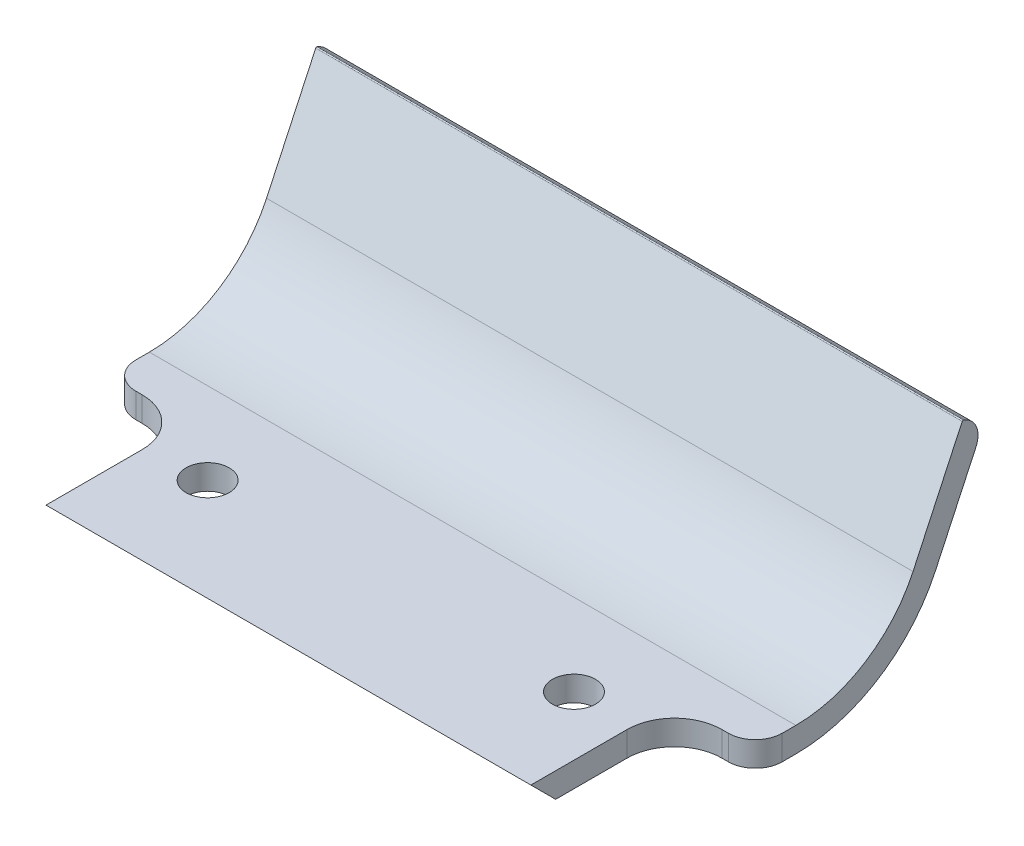
ISO-10303-21;
HEADER;
FILE_DESCRIPTION(('STEP AP214'),'2;1');
FILE_NAME('part.step','',(''),(''),'','','');
FILE_SCHEMA(('AUTOMOTIVE_DESIGN { 1 0 10303 214 1 1 1 1 }'));
ENDSEC;
DATA;
#1=APPLICATION_CONTEXT('core data for automotive mechanical design processes');
#2=APPLICATION_PROTOCOL_DEFINITION('international standard','automotive_design',2000,#1);
#3=PRODUCT_CONTEXT('',#1,'mechanical');
#4=PRODUCT('Part','Part','',(#3));
#5=PRODUCT_RELATED_PRODUCT_CATEGORY('part','',(#4));
#6=PRODUCT_DEFINITION_FORMATION('','',#4);
#7=PRODUCT_DEFINITION_CONTEXT('part definition',#1,'design');
#8=PRODUCT_DEFINITION('design','',#6,#7);
#9=PRODUCT_DEFINITION_SHAPE('','',#8);
#10=(LENGTH_UNIT() NAMED_UNIT(*) SI_UNIT(.MILLI.,.METRE.));
#11=(NAMED_UNIT(*) PLANE_ANGLE_UNIT() SI_UNIT($,.RADIAN.));
#12=(NAMED_UNIT(*) SI_UNIT($,.STERADIAN.) SOLID_ANGLE_UNIT());
#13=UNCERTAINTY_MEASURE_WITH_UNIT(LENGTH_MEASURE(1.E-05),#10,'distance_accuracy_value','');
#14=(GEOMETRIC_REPRESENTATION_CONTEXT(3) GLOBAL_UNCERTAINTY_ASSIGNED_CONTEXT((#13)) GLOBAL_UNIT_ASSIGNED_CONTEXT((#10,
#11,#12)) REPRESENTATION_CONTEXT('',''));
#15=CARTESIAN_POINT('',(0.,0.,0.));
#16=DIRECTION('',(0.,0.,1.));
#17=DIRECTION('',(1.,0.,0.));
#18=AXIS2_PLACEMENT_3D('',#15,#16,#17);
#19=CARTESIAN_POINT('',(30.,0.,0.));
#20=DIRECTION('',(0.,0.707106781186556,-0.707106781186539));
#21=DIRECTION('',(0.,0.707106781186539,0.707106781186556));
#22=AXIS2_PLACEMENT_3D('',#19,#20,#21);
#23=PLANE('',#22);
#24=DIRECTION('',(0.,0.707106781186539,0.707106781186556));
#25=VECTOR('',#24,1.);
#26=CARTESIAN_POINT('',(-22.5,0.,0.));
#27=LINE('',#26,#25);
#28=CARTESIAN_POINT('',(-22.5,-2.3,-2.30000000000006));
#29=VERTEX_POINT('',#28);
#30=CARTESIAN_POINT('',(-22.5,0.,0.));
#31=VERTEX_POINT('',#30);
#32=EDGE_CURVE('E249',#29,#31,#27,.T.);
#33=ORIENTED_EDGE('',*,*,#32,.F.);
#34=DIRECTION('',(-1.,0.,0.));
#35=VECTOR('',#34,1.);
#36=CARTESIAN_POINT('',(30.,-2.3,-2.30000000000006));
#37=LINE('',#36,#35);
#38=CARTESIAN_POINT('',(22.5,-2.3,-2.30000000000006));
#39=VERTEX_POINT('',#38);
#40=EDGE_CURVE('E344',#39,#29,#37,.T.);
#41=ORIENTED_EDGE('',*,*,#40,.F.);
#42=DIRECTION('',(0.,0.707106781186539,0.707106781186556));
#43=VECTOR('',#42,1.);
#44=CARTESIAN_POINT('',(22.5,0.,0.));
#45=LINE('',#44,#43);
#46=CARTESIAN_POINT('',(22.5,0.,0.));
#47=VERTEX_POINT('',#46);
#48=EDGE_CURVE('E201',#39,#47,#45,.T.);
#49=ORIENTED_EDGE('',*,*,#48,.T.);
#50=DIRECTION('',(-1.,0.,0.));
#51=VECTOR('',#50,1.);
#52=CARTESIAN_POINT('',(30.,0.,0.));
#53=LINE('',#52,#51);
#54=EDGE_CURVE('E282',#47,#31,#53,.T.);
#55=ORIENTED_EDGE('',*,*,#54,.T.);
#56=EDGE_LOOP('',(#33,#41,#49,#55));
#57=FACE_BOUND('',#56,.T.);
#58=ADVANCED_FACE('F39',(#57),#23,.F.);
#59=CARTESIAN_POINT('',(30.,-2.3,-2.30000000000006));
#60=DIRECTION('',(0.,1.,0.));
#61=DIRECTION('',(0.,0.,1.));
#62=AXIS2_PLACEMENT_3D('',#59,#60,#61);
#63=PLANE('',#62);
#64=CARTESIAN_POINT('',(17.,-2.3,-9.5));
#65=DIRECTION('',(0.,1.,0.));
#66=DIRECTION('',(0.,0.,1.));
#67=AXIS2_PLACEMENT_3D('',#64,#65,#66);
#68=CIRCLE('',#67,2.);
#69=CARTESIAN_POINT('',(17.,-2.3,-7.5));
#70=VERTEX_POINT('',#69);
#71=EDGE_CURVE('E210',#70,#70,#68,.F.);
#72=ORIENTED_EDGE('',*,*,#71,.F.);
#73=EDGE_LOOP('',(#72));
#74=FACE_BOUND('',#73,.T.);
#75=CARTESIAN_POINT('',(-17.,-2.3,-9.5));
#76=DIRECTION('',(0.,1.,0.));
#77=DIRECTION('',(0.,0.,1.));
#78=AXIS2_PLACEMENT_3D('',#75,#76,#77);
#79=CIRCLE('',#78,2.);
#80=CARTESIAN_POINT('',(-17.,-2.3,-7.5));
#81=VERTEX_POINT('',#80);
#82=EDGE_CURVE('E197',#81,#81,#79,.T.);
#83=ORIENTED_EDGE('',*,*,#82,.T.);
#84=EDGE_LOOP('',(#83));
#85=FACE_BOUND('',#84,.T.);
#86=DIRECTION('',(0.,0.,-1.));
#87=VECTOR('',#86,1.);
#88=CARTESIAN_POINT('',(30.,-2.3,-2.30000000000006));
#89=LINE('',#88,#87);
#90=CARTESIAN_POINT('',(30.,-2.3,-15.83));
#91=VERTEX_POINT('',#90);
#92=CARTESIAN_POINT('',(30.,-2.3,-17.09318355687));
#93=VERTEX_POINT('',#92);
#94=EDGE_CURVE('E253',#91,#93,#89,.T.);
#95=ORIENTED_EDGE('',*,*,#94,.F.);
#96=CARTESIAN_POINT('',(27.5,-2.3,-15.83));
#97=DIRECTION('',(0.,1.,0.));
#98=DIRECTION('',(0.,0.,1.));
#99=AXIS2_PLACEMENT_3D('',#96,#97,#98);
#100=CIRCLE('',#99,2.5);
#101=CARTESIAN_POINT('',(27.5,-2.3,-13.33));
#102=VERTEX_POINT('',#101);
#103=EDGE_CURVE('E362',#91,#102,#100,.F.);
#104=ORIENTED_EDGE('',*,*,#103,.T.);
#105=DIRECTION('',(-1.,0.,0.));
#106=VECTOR('',#105,1.);
#107=CARTESIAN_POINT('',(0.,-2.3,-13.33));
#108=LINE('',#107,#106);
#109=CARTESIAN_POINT('',(26.9,-2.3,-13.33));
#110=VERTEX_POINT('',#109);
#111=EDGE_CURVE('E219',#102,#110,#108,.T.);
#112=ORIENTED_EDGE('',*,*,#111,.T.);
#113=CARTESIAN_POINT('',(26.9,-2.3,-8.93));
#114=DIRECTION('',(0.,1.,0.));
#115=DIRECTION('',(0.,0.,1.));
#116=AXIS2_PLACEMENT_3D('',#113,#114,#115);
#117=CIRCLE('',#116,4.4);
#118=CARTESIAN_POINT('',(22.5,-2.3,-8.92999999999997));
#119=VERTEX_POINT('',#118);
#120=EDGE_CURVE('E222',#110,#119,#117,.T.);
#121=ORIENTED_EDGE('',*,*,#120,.T.);
#122=DIRECTION('',(0.,0.,1.));
#123=VECTOR('',#122,1.);
#124=CARTESIAN_POINT('',(22.5,-2.3,0.));
#125=LINE('',#124,#123);
#126=EDGE_CURVE('E227',#119,#39,#125,.T.);
#127=ORIENTED_EDGE('',*,*,#126,.T.);
#128=ORIENTED_EDGE('',*,*,#40,.T.);
#129=DIRECTION('',(0.,0.,1.));
#130=VECTOR('',#129,1.);
#131=CARTESIAN_POINT('',(-22.5,-2.3,0.));
#132=LINE('',#131,#130);
#133=CARTESIAN_POINT('',(-22.5,-2.3,-8.92999999999997));
#134=VERTEX_POINT('',#133);
#135=EDGE_CURVE('E169',#134,#29,#132,.T.);
#136=ORIENTED_EDGE('',*,*,#135,.F.);
#137=CARTESIAN_POINT('',(-26.9,-2.3,-8.93));
#138=DIRECTION('',(0.,1.,0.));
#139=DIRECTION('',(0.,0.,1.));
#140=AXIS2_PLACEMENT_3D('',#137,#138,#139);
#141=CIRCLE('',#140,4.4);
#142=CARTESIAN_POINT('',(-26.9,-2.3,-13.33));
#143=VERTEX_POINT('',#142);
#144=EDGE_CURVE('E170',#143,#134,#141,.F.);
#145=ORIENTED_EDGE('',*,*,#144,.F.);
#146=DIRECTION('',(1.,0.,0.));
#147=VECTOR('',#146,1.);
#148=CARTESIAN_POINT('',(0.,-2.3,-13.33));
#149=LINE('',#148,#147);
#150=CARTESIAN_POINT('',(-27.5,-2.3,-13.33));
#151=VERTEX_POINT('',#150);
#152=EDGE_CURVE('E162',#151,#143,#149,.T.);
#153=ORIENTED_EDGE('',*,*,#152,.F.);
#154=CARTESIAN_POINT('',(-27.5,-2.3,-15.83));
#155=DIRECTION('',(0.,1.,0.));
#156=DIRECTION('',(0.,0.,1.));
#157=AXIS2_PLACEMENT_3D('',#154,#155,#156);
#158=CIRCLE('',#157,2.5);
#159=CARTESIAN_POINT('',(-30.,-2.3,-15.83));
#160=VERTEX_POINT('',#159);
#161=EDGE_CURVE('E55',#151,#160,#158,.F.);
#162=ORIENTED_EDGE('',*,*,#161,.T.);
#163=DIRECTION('',(0.,0.,-1.));
#164=VECTOR('',#163,1.);
#165=CARTESIAN_POINT('',(-30.,-2.3,-2.30000000000006));
#166=LINE('',#165,#164);
#167=CARTESIAN_POINT('',(-30.,-2.3,-17.09318355687));
#168=VERTEX_POINT('',#167);
#169=EDGE_CURVE('E252',#160,#168,#166,.T.);
#170=ORIENTED_EDGE('',*,*,#169,.T.);
#171=DIRECTION('',(-1.,0.,0.));
#172=VECTOR('',#171,1.);
#173=CARTESIAN_POINT('',(30.,-2.3,-17.09318355687));
#174=LINE('',#173,#172);
#175=EDGE_CURVE('E340',#93,#168,#174,.T.);
#176=ORIENTED_EDGE('',*,*,#175,.F.);
#177=EDGE_LOOP('',(#95,#104,#112,#121,#127,#128,#136,#145,#153,#162,#170,#176));
#178=FACE_BOUND('',#177,.T.);
#179=ADVANCED_FACE('F183',(#74,#85,#178),#63,.F.);
#180=CARTESIAN_POINT('',(30.,0.,0.));
#181=DIRECTION('',(0.,-1.,0.));
#182=DIRECTION('',(0.,0.,-1.));
#183=AXIS2_PLACEMENT_3D('',#180,#181,#182);
#184=PLANE('',#183);
#185=CARTESIAN_POINT('',(17.,0.,-9.5));
#186=DIRECTION('',(0.,1.,0.));
#187=DIRECTION('',(0.,0.,1.));
#188=AXIS2_PLACEMENT_3D('',#185,#186,#187);
#189=CIRCLE('',#188,2.);
#190=CARTESIAN_POINT('',(17.,0.,-7.5));
#191=VERTEX_POINT('',#190);
#192=EDGE_CURVE('E214',#191,#191,#189,.F.);
#193=ORIENTED_EDGE('',*,*,#192,.T.);
#194=EDGE_LOOP('',(#193));
#195=FACE_BOUND('',#194,.T.);
#196=CARTESIAN_POINT('',(-17.,0.,-9.5));
#197=DIRECTION('',(0.,1.,0.));
#198=DIRECTION('',(0.,0.,1.));
#199=AXIS2_PLACEMENT_3D('',#196,#197,#198);
#200=CIRCLE('',#199,2.);
#201=CARTESIAN_POINT('',(-17.,0.,-7.5));
#202=VERTEX_POINT('',#201);
#203=EDGE_CURVE('E206',#202,#202,#200,.T.);
#204=ORIENTED_EDGE('',*,*,#203,.F.);
#205=EDGE_LOOP('',(#204));
#206=FACE_BOUND('',#205,.T.);
#207=DIRECTION('',(-1.,0.,0.));
#208=VECTOR('',#207,1.);
#209=CARTESIAN_POINT('',(0.,0.,-13.33));
#210=LINE('',#209,#208);
#211=CARTESIAN_POINT('',(27.5,0.,-13.33));
#212=VERTEX_POINT('',#211);
#213=CARTESIAN_POINT('',(26.9,0.,-13.33));
#214=VERTEX_POINT('',#213);
#215=EDGE_CURVE('E232',#212,#214,#210,.T.);
#216=ORIENTED_EDGE('',*,*,#215,.F.);
#217=CARTESIAN_POINT('',(27.5,0.,-15.83));
#218=DIRECTION('',(0.,-1.,0.));
#219=DIRECTION('',(0.,0.,-1.));
#220=AXIS2_PLACEMENT_3D('',#217,#218,#219);
#221=CIRCLE('',#220,2.5);
#222=CARTESIAN_POINT('',(30.,0.,-15.83));
#223=VERTEX_POINT('',#222);
#224=EDGE_CURVE('E354',#212,#223,#221,.F.);
#225=ORIENTED_EDGE('',*,*,#224,.T.);
#226=DIRECTION('',(0.,0.,1.));
#227=VECTOR('',#226,1.);
#228=CARTESIAN_POINT('',(30.,0.,0.));
#229=LINE('',#228,#227);
#230=CARTESIAN_POINT('',(30.,0.,-17.09318355687));
#231=VERTEX_POINT('',#230);
#232=EDGE_CURVE('E278',#231,#223,#229,.T.);
#233=ORIENTED_EDGE('',*,*,#232,.F.);
#234=DIRECTION('',(-1.,0.,0.));
#235=VECTOR('',#234,1.);
#236=CARTESIAN_POINT('',(30.,0.,-17.09318355687));
#237=LINE('',#236,#235);
#238=CARTESIAN_POINT('',(-30.,0.,-17.09318355687));
#239=VERTEX_POINT('',#238);
#240=EDGE_CURVE('E312',#231,#239,#237,.T.);
#241=ORIENTED_EDGE('',*,*,#240,.T.);
#242=DIRECTION('',(0.,0.,1.));
#243=VECTOR('',#242,1.);
#244=CARTESIAN_POINT('',(-30.,0.,0.));
#245=LINE('',#244,#243);
#246=CARTESIAN_POINT('',(-30.,0.,-15.83));
#247=VERTEX_POINT('',#246);
#248=EDGE_CURVE('E257',#239,#247,#245,.T.);
#249=ORIENTED_EDGE('',*,*,#248,.T.);
#250=CARTESIAN_POINT('',(-27.5,0.,-15.83));
#251=DIRECTION('',(0.,-1.,0.));
#252=DIRECTION('',(0.,0.,-1.));
#253=AXIS2_PLACEMENT_3D('',#250,#251,#252);
#254=CIRCLE('',#253,2.5);
#255=CARTESIAN_POINT('',(-27.5,0.,-13.33));
#256=VERTEX_POINT('',#255);
#257=EDGE_CURVE('E351',#247,#256,#254,.F.);
#258=ORIENTED_EDGE('',*,*,#257,.T.);
#259=DIRECTION('',(1.,0.,0.));
#260=VECTOR('',#259,1.);
#261=CARTESIAN_POINT('',(0.,0.,-13.33));
#262=LINE('',#261,#260);
#263=CARTESIAN_POINT('',(-26.9,0.,-13.33));
#264=VERTEX_POINT('',#263);
#265=EDGE_CURVE('E190',#256,#264,#262,.T.);
#266=ORIENTED_EDGE('',*,*,#265,.T.);
#267=CARTESIAN_POINT('',(-26.9,0.,-8.93));
#268=DIRECTION('',(0.,1.,0.));
#269=DIRECTION('',(0.,0.,1.));
#270=AXIS2_PLACEMENT_3D('',#267,#268,#269);
#271=CIRCLE('',#270,4.4);
#272=CARTESIAN_POINT('',(-22.5,0.,-8.92999999999997));
#273=VERTEX_POINT('',#272);
#274=EDGE_CURVE('E177',#264,#273,#271,.F.);
#275=ORIENTED_EDGE('',*,*,#274,.T.);
#276=DIRECTION('',(0.,0.,1.));
#277=VECTOR('',#276,1.);
#278=CARTESIAN_POINT('',(-22.5,0.,0.));
#279=LINE('',#278,#277);
#280=EDGE_CURVE('E186',#273,#31,#279,.T.);
#281=ORIENTED_EDGE('',*,*,#280,.T.);
#282=ORIENTED_EDGE('',*,*,#54,.F.);
#283=DIRECTION('',(0.,0.,1.));
#284=VECTOR('',#283,1.);
#285=CARTESIAN_POINT('',(22.5,0.,0.));
#286=LINE('',#285,#284);
#287=CARTESIAN_POINT('',(22.5,0.,-8.92999999999997));
#288=VERTEX_POINT('',#287);
#289=EDGE_CURVE('E223',#288,#47,#286,.T.);
#290=ORIENTED_EDGE('',*,*,#289,.F.);
#291=CARTESIAN_POINT('',(26.9,0.,-8.93));
#292=DIRECTION('',(0.,1.,0.));
#293=DIRECTION('',(0.,0.,1.));
#294=AXIS2_PLACEMENT_3D('',#291,#292,#293);
#295=CIRCLE('',#294,4.4);
#296=EDGE_CURVE('E235',#214,#288,#295,.T.);
#297=ORIENTED_EDGE('',*,*,#296,.F.);
#298=EDGE_LOOP('',(#216,#225,#233,#241,#249,#258,#266,#275,#281,#282,#290,#297));
#299=FACE_BOUND('',#298,.T.);
#300=ADVANCED_FACE('F375',(#195,#206,#299),#184,.F.);
#301=CARTESIAN_POINT('',(-30.,12.,-17.09318355687));
#302=DIRECTION('',(1.,0.,0.));
#303=DIRECTION('',(0.,0.,-1.));
#304=AXIS2_PLACEMENT_3D('',#301,#302,#303);
#305=PLANE('',#304);
#306=ORIENTED_EDGE('',*,*,#169,.F.);
#307=DIRECTION('',(0.,1.,0.));
#308=VECTOR('',#307,1.);
#309=CARTESIAN_POINT('',(-30.,0.,-15.83));
#310=LINE('',#309,#308);
#311=EDGE_CURVE('E48',#160,#247,#310,.T.);
#312=ORIENTED_EDGE('',*,*,#311,.T.);
#313=ORIENTED_EDGE('',*,*,#248,.F.);
#314=CARTESIAN_POINT('',(-30.,12.,-17.09318355687));
#315=DIRECTION('',(-1.,0.,0.));
#316=DIRECTION('',(0.,0.,-1.));
#317=AXIS2_PLACEMENT_3D('',#314,#315,#316);
#318=CIRCLE('',#317,12.);
#319=CARTESIAN_POINT('',(-30.,6.9285808591116,-27.9688770013098));
#320=VERTEX_POINT('',#319);
#321=EDGE_CURVE('E303',#320,#239,#318,.T.);
#322=ORIENTED_EDGE('',*,*,#321,.F.);
#323=DIRECTION('',(0.,-0.90630778703665,0.4226182617407));
#324=VECTOR('',#323,1.);
#325=CARTESIAN_POINT('',(-30.,6.9285808591116,-27.9688770013098));
#326=LINE('',#325,#324);
#327=CARTESIAN_POINT('',(-30.,16.7122618261741,-32.5310823611963));
#328=VERTEX_POINT('',#327);
#329=EDGE_CURVE('E300',#328,#320,#326,.T.);
#330=ORIENTED_EDGE('',*,*,#329,.F.);
#331=CARTESIAN_POINT('',(-30.,16.67,-32.6217131399));
#332=DIRECTION('',(1.,0.,0.));
#333=DIRECTION('',(0.,0.,1.));
#334=AXIS2_PLACEMENT_3D('',#331,#332,#333);
#335=CIRCLE('',#334,0.100000000000001);
#336=CARTESIAN_POINT('',(-30.,16.7606307787037,-32.6639749660741));
#337=VERTEX_POINT('',#336);
#338=EDGE_CURVE('E297',#337,#328,#335,.T.);
#339=ORIENTED_EDGE('',*,*,#338,.F.);
#340=DIRECTION('',(0.,0.42261826174073,0.906307787036636));
#341=VECTOR('',#340,1.);
#342=CARTESIAN_POINT('',(-30.,16.7606307787037,-32.6639749660741));
#343=LINE('',#342,#341);
#344=CARTESIAN_POINT('',(-30.,16.6761071263555,-32.8452365234814));
#345=VERTEX_POINT('',#344);
#346=EDGE_CURVE('E294',#345,#337,#343,.T.);
#347=ORIENTED_EDGE('',*,*,#346,.F.);
#348=CARTESIAN_POINT('',(-30.,14.8634915522822,-32.));
#349=DIRECTION('',(1.,0.,0.));
#350=DIRECTION('',(0.,0.,-1.));
#351=AXIS2_PLACEMENT_3D('',#348,#349,#350);
#352=CIRCLE('',#351,2.);
#353=CARTESIAN_POINT('',(-30.,14.0182550288008,-33.8126155740733));
#354=VERTEX_POINT('',#353);
#355=EDGE_CURVE('E291',#354,#345,#352,.T.);
#356=ORIENTED_EDGE('',*,*,#355,.F.);
#357=DIRECTION('',(0.,0.906307787036649,-0.4226182617407));
#358=VECTOR('',#357,1.);
#359=CARTESIAN_POINT('',(-30.,5.95655885710798,-30.0533849114941));
#360=LINE('',#359,#358);
#361=CARTESIAN_POINT('',(-30.,5.95655885710798,-30.0533849114941));
#362=VERTEX_POINT('',#361);
#363=EDGE_CURVE('E288',#362,#354,#360,.T.);
#364=ORIENTED_EDGE('',*,*,#363,.F.);
#365=CARTESIAN_POINT('',(-30.,12.,-17.09318355687));
#366=DIRECTION('',(1.,0.,0.));
#367=DIRECTION('',(0.,0.,-1.));
#368=AXIS2_PLACEMENT_3D('',#365,#366,#367);
#369=CIRCLE('',#368,14.3);
#370=EDGE_CURVE('E285',#168,#362,#369,.T.);
#371=ORIENTED_EDGE('',*,*,#370,.F.);
#372=EDGE_LOOP('',(#306,#312,#313,#322,#330,#339,#347,#356,#364,#371));
#373=FACE_BOUND('',#372,.T.);
#374=ADVANCED_FACE('F369',(#373),#305,.F.);
#375=CARTESIAN_POINT('',(30.,12.,-17.09318355687));
#376=DIRECTION('',(-1.,0.,0.));
#377=DIRECTION('',(0.,0.,1.));
#378=AXIS2_PLACEMENT_3D('',#375,#376,#377);
#379=CYLINDRICAL_SURFACE('',#378,14.3);
#380=ORIENTED_EDGE('',*,*,#370,.T.);
#381=DIRECTION('',(-1.,0.,0.));
#382=VECTOR('',#381,1.);
#383=CARTESIAN_POINT('',(30.,5.95655885710798,-30.0533849114941));
#384=LINE('',#383,#382);
#385=CARTESIAN_POINT('',(30.,5.95655885710798,-30.0533849114941));
#386=VERTEX_POINT('',#385);
#387=EDGE_CURVE('E336',#386,#362,#384,.T.);
#388=ORIENTED_EDGE('',*,*,#387,.F.);
#389=CARTESIAN_POINT('',(30.,12.,-17.09318355687));
#390=DIRECTION('',(1.,0.,0.));
#391=DIRECTION('',(0.,0.,-1.));
#392=AXIS2_PLACEMENT_3D('',#389,#390,#391);
#393=CIRCLE('',#392,14.3);
#394=EDGE_CURVE('E256',#93,#386,#393,.T.);
#395=ORIENTED_EDGE('',*,*,#394,.F.);
#396=ORIENTED_EDGE('',*,*,#175,.T.);
#397=EDGE_LOOP('',(#380,#388,#395,#396));
#398=FACE_BOUND('',#397,.T.);
#399=ADVANCED_FACE('F409',(#398),#379,.T.);
#400=CARTESIAN_POINT('',(30.,5.95655885710798,-30.0533849114941));
#401=DIRECTION('',(0.,0.4226182617407,0.906307787036649));
#402=DIRECTION('',(0.,-0.90630778703665,0.4226182617407));
#403=AXIS2_PLACEMENT_3D('',#400,#401,#402);
#404=PLANE('',#403);
#405=ORIENTED_EDGE('',*,*,#363,.T.);
#406=DIRECTION('',(-1.,0.,0.));
#407=VECTOR('',#406,1.);
#408=CARTESIAN_POINT('',(30.,14.0182550288008,-33.8126155740733));
#409=LINE('',#408,#407);
#410=CARTESIAN_POINT('',(30.,14.0182550288008,-33.8126155740733));
#411=VERTEX_POINT('',#410);
#412=EDGE_CURVE('E332',#411,#354,#409,.T.);
#413=ORIENTED_EDGE('',*,*,#412,.F.);
#414=DIRECTION('',(0.,0.906307787036649,-0.4226182617407));
#415=VECTOR('',#414,1.);
#416=CARTESIAN_POINT('',(30.,5.95655885710798,-30.0533849114941));
#417=LINE('',#416,#415);
#418=EDGE_CURVE('E260',#386,#411,#417,.T.);
#419=ORIENTED_EDGE('',*,*,#418,.F.);
#420=ORIENTED_EDGE('',*,*,#387,.T.);
#421=EDGE_LOOP('',(#405,#413,#419,#420));
#422=FACE_BOUND('',#421,.T.);
#423=ADVANCED_FACE('F405',(#422),#404,.F.);
#424=CARTESIAN_POINT('',(30.,14.8634915522822,-32.));
#425=DIRECTION('',(-1.,0.,0.));
#426=DIRECTION('',(0.,0.,1.));
#427=AXIS2_PLACEMENT_3D('',#424,#425,#426);
#428=CYLINDRICAL_SURFACE('',#427,2.);
#429=ORIENTED_EDGE('',*,*,#355,.T.);
#430=DIRECTION('',(-1.,0.,0.));
#431=VECTOR('',#430,1.);
#432=CARTESIAN_POINT('',(30.,16.6761071263555,-32.8452365234814));
#433=LINE('',#432,#431);
#434=CARTESIAN_POINT('',(30.,16.6761071263555,-32.8452365234814));
#435=VERTEX_POINT('',#434);
#436=EDGE_CURVE('E328',#435,#345,#433,.T.);
#437=ORIENTED_EDGE('',*,*,#436,.F.);
#438=CARTESIAN_POINT('',(30.,14.8634915522822,-32.));
#439=DIRECTION('',(1.,0.,0.));
#440=DIRECTION('',(0.,0.,-1.));
#441=AXIS2_PLACEMENT_3D('',#438,#439,#440);
#442=CIRCLE('',#441,2.);
#443=EDGE_CURVE('E263',#411,#435,#442,.T.);
#444=ORIENTED_EDGE('',*,*,#443,.F.);
#445=ORIENTED_EDGE('',*,*,#412,.T.);
#446=EDGE_LOOP('',(#429,#437,#444,#445));
#447=FACE_BOUND('',#446,.T.);
#448=ADVANCED_FACE('F400',(#447),#428,.T.);
#449=CARTESIAN_POINT('',(30.,16.7606307787037,-32.6639749660741));
#450=DIRECTION('',(0.,-0.906307787036636,0.42261826174073));
#451=DIRECTION('',(0.,-0.42261826174073,-0.906307787036636));
#452=AXIS2_PLACEMENT_3D('',#449,#450,#451);
#453=PLANE('',#452);
#454=ORIENTED_EDGE('',*,*,#346,.T.);
#455=DIRECTION('',(-1.,0.,0.));
#456=VECTOR('',#455,1.);
#457=CARTESIAN_POINT('',(30.,16.7606307787037,-32.6639749660741));
#458=LINE('',#457,#456);
#459=CARTESIAN_POINT('',(30.,16.7606307787037,-32.6639749660741));
#460=VERTEX_POINT('',#459);
#461=EDGE_CURVE('E324',#460,#337,#458,.T.);
#462=ORIENTED_EDGE('',*,*,#461,.F.);
#463=DIRECTION('',(0.,0.42261826174073,0.906307787036636));
#464=VECTOR('',#463,1.);
#465=CARTESIAN_POINT('',(30.,16.7606307787037,-32.6639749660741));
#466=LINE('',#465,#464);
#467=EDGE_CURVE('E266',#435,#460,#466,.T.);
#468=ORIENTED_EDGE('',*,*,#467,.F.);
#469=ORIENTED_EDGE('',*,*,#436,.T.);
#470=EDGE_LOOP('',(#454,#462,#468,#469));
#471=FACE_BOUND('',#470,.T.);
#472=ADVANCED_FACE('F395',(#471),#453,.F.);
#473=CARTESIAN_POINT('',(30.,16.67,-32.6217131399));
#474=DIRECTION('',(-1.,0.,0.));
#475=DIRECTION('',(0.,0.,1.));
#476=AXIS2_PLACEMENT_3D('',#473,#474,#475);
#477=CYLINDRICAL_SURFACE('',#476,0.100000000000001);
#478=ORIENTED_EDGE('',*,*,#338,.T.);
#479=DIRECTION('',(-1.,0.,0.));
#480=VECTOR('',#479,1.);
#481=CARTESIAN_POINT('',(30.,16.7122618261741,-32.5310823611963));
#482=LINE('',#481,#480);
#483=CARTESIAN_POINT('',(30.,16.7122618261741,-32.5310823611963));
#484=VERTEX_POINT('',#483);
#485=EDGE_CURVE('E320',#484,#328,#482,.T.);
#486=ORIENTED_EDGE('',*,*,#485,.F.);
#487=CARTESIAN_POINT('',(30.,16.67,-32.6217131399));
#488=DIRECTION('',(1.,0.,0.));
#489=DIRECTION('',(0.,0.,1.));
#490=AXIS2_PLACEMENT_3D('',#487,#488,#489);
#491=CIRCLE('',#490,0.100000000000001);
#492=EDGE_CURVE('E269',#460,#484,#491,.T.);
#493=ORIENTED_EDGE('',*,*,#492,.F.);
#494=ORIENTED_EDGE('',*,*,#461,.T.);
#495=EDGE_LOOP('',(#478,#486,#493,#494));
#496=FACE_BOUND('',#495,.T.);
#497=ADVANCED_FACE('F391',(#496),#477,.T.);
#498=CARTESIAN_POINT('',(30.,6.9285808591116,-27.9688770013098));
#499=DIRECTION('',(0.,-0.4226182617407,-0.90630778703665));
#500=DIRECTION('',(0.,0.90630778703665,-0.4226182617407));
#501=AXIS2_PLACEMENT_3D('',#498,#499,#500);
#502=PLANE('',#501);
#503=ORIENTED_EDGE('',*,*,#329,.T.);
#504=DIRECTION('',(-1.,0.,0.));
#505=VECTOR('',#504,1.);
#506=CARTESIAN_POINT('',(30.,6.9285808591116,-27.9688770013098));
#507=LINE('',#506,#505);
#508=CARTESIAN_POINT('',(30.,6.9285808591116,-27.9688770013098));
#509=VERTEX_POINT('',#508);
#510=EDGE_CURVE('E316',#509,#320,#507,.T.);
#511=ORIENTED_EDGE('',*,*,#510,.F.);
#512=DIRECTION('',(0.,-0.90630778703665,0.4226182617407));
#513=VECTOR('',#512,1.);
#514=CARTESIAN_POINT('',(30.,6.9285808591116,-27.9688770013098));
#515=LINE('',#514,#513);
#516=EDGE_CURVE('E272',#484,#509,#515,.T.);
#517=ORIENTED_EDGE('',*,*,#516,.F.);
#518=ORIENTED_EDGE('',*,*,#485,.T.);
#519=EDGE_LOOP('',(#503,#511,#517,#518));
#520=FACE_BOUND('',#519,.T.);
#521=ADVANCED_FACE('F386',(#520),#502,.F.);
#522=CARTESIAN_POINT('',(30.,12.,-17.09318355687));
#523=DIRECTION('',(-1.,0.,0.));
#524=DIRECTION('',(0.,0.,1.));
#525=AXIS2_PLACEMENT_3D('',#522,#523,#524);
#526=CYLINDRICAL_SURFACE('',#525,12.);
#527=ORIENTED_EDGE('',*,*,#321,.T.);
#528=ORIENTED_EDGE('',*,*,#240,.F.);
#529=CARTESIAN_POINT('',(30.,12.,-17.09318355687));
#530=DIRECTION('',(-1.,0.,0.));
#531=DIRECTION('',(0.,0.,-1.));
#532=AXIS2_PLACEMENT_3D('',#529,#530,#531);
#533=CIRCLE('',#532,12.);
#534=EDGE_CURVE('E275',#509,#231,#533,.T.);
#535=ORIENTED_EDGE('',*,*,#534,.F.);
#536=ORIENTED_EDGE('',*,*,#510,.T.);
#537=EDGE_LOOP('',(#527,#528,#535,#536));
#538=FACE_BOUND('',#537,.T.);
#539=ADVANCED_FACE('F380',(#538),#526,.F.);
#540=CARTESIAN_POINT('',(30.,12.,-17.09318355687));
#541=DIRECTION('',(1.,0.,0.));
#542=DIRECTION('',(0.,0.,-1.));
#543=AXIS2_PLACEMENT_3D('',#540,#541,#542);
#544=PLANE('',#543);
#545=ORIENTED_EDGE('',*,*,#232,.T.);
#546=DIRECTION('',(0.,1.,0.));
#547=VECTOR('',#546,1.);
#548=CARTESIAN_POINT('',(30.,-2.3,-15.83));
#549=LINE('',#548,#547);
#550=EDGE_CURVE('E357',#223,#91,#549,.F.);
#551=ORIENTED_EDGE('',*,*,#550,.T.);
#552=ORIENTED_EDGE('',*,*,#94,.T.);
#553=ORIENTED_EDGE('',*,*,#394,.T.);
#554=ORIENTED_EDGE('',*,*,#418,.T.);
#555=ORIENTED_EDGE('',*,*,#443,.T.);
#556=ORIENTED_EDGE('',*,*,#467,.T.);
#557=ORIENTED_EDGE('',*,*,#492,.T.);
#558=ORIENTED_EDGE('',*,*,#516,.T.);
#559=ORIENTED_EDGE('',*,*,#534,.T.);
#560=EDGE_LOOP('',(#545,#551,#552,#553,#554,#555,#556,#557,#558,#559));
#561=FACE_BOUND('',#560,.T.);
#562=ADVANCED_FACE('F461',(#561),#544,.T.);
#563=CARTESIAN_POINT('',(-22.5,-2.3,0.));
#564=DIRECTION('',(-1.,0.,0.));
#565=DIRECTION('',(0.,0.,1.));
#566=AXIS2_PLACEMENT_3D('',#563,#564,#565);
#567=PLANE('',#566);
#568=ORIENTED_EDGE('',*,*,#32,.T.);
#569=ORIENTED_EDGE('',*,*,#280,.F.);
#570=DIRECTION('',(0.,1.,0.));
#571=VECTOR('',#570,1.);
#572=CARTESIAN_POINT('',(-22.5,-2.3,-8.92999999999997));
#573=LINE('',#572,#571);
#574=EDGE_CURVE('E179',#134,#273,#573,.T.);
#575=ORIENTED_EDGE('',*,*,#574,.F.);
#576=ORIENTED_EDGE('',*,*,#135,.T.);
#577=EDGE_LOOP('',(#568,#569,#575,#576));
#578=FACE_BOUND('',#577,.T.);
#579=ADVANCED_FACE('F433',(#578),#567,.T.);
#580=CARTESIAN_POINT('',(-26.9,-2.3,-8.93));
#581=DIRECTION('',(0.,1.,0.));
#582=DIRECTION('',(0.,0.,1.));
#583=AXIS2_PLACEMENT_3D('',#580,#581,#582);
#584=CYLINDRICAL_SURFACE('',#583,4.4);
#585=ORIENTED_EDGE('',*,*,#274,.F.);
#586=DIRECTION('',(0.,1.,0.));
#587=VECTOR('',#586,1.);
#588=CARTESIAN_POINT('',(-26.9,-2.3,-13.33));
#589=LINE('',#588,#587);
#590=EDGE_CURVE('E165',#143,#264,#589,.T.);
#591=ORIENTED_EDGE('',*,*,#590,.F.);
#592=ORIENTED_EDGE('',*,*,#144,.T.);
#593=ORIENTED_EDGE('',*,*,#574,.T.);
#594=EDGE_LOOP('',(#585,#591,#592,#593));
#595=FACE_BOUND('',#594,.T.);
#596=ADVANCED_FACE('F173',(#595),#584,.F.);
#597=CARTESIAN_POINT('',(0.,-2.3,-13.33));
#598=DIRECTION('',(0.,0.,1.));
#599=DIRECTION('',(1.,0.,0.));
#600=AXIS2_PLACEMENT_3D('',#597,#598,#599);
#601=PLANE('',#600);
#602=ORIENTED_EDGE('',*,*,#265,.F.);
#603=DIRECTION('',(0.,1.,0.));
#604=VECTOR('',#603,1.);
#605=CARTESIAN_POINT('',(-27.5,-2.3,-13.33));
#606=LINE('',#605,#604);
#607=EDGE_CURVE('E11',#256,#151,#606,.F.);
#608=ORIENTED_EDGE('',*,*,#607,.T.);
#609=ORIENTED_EDGE('',*,*,#152,.T.);
#610=ORIENTED_EDGE('',*,*,#590,.T.);
#611=EDGE_LOOP('',(#602,#608,#609,#610));
#612=FACE_BOUND('',#611,.T.);
#613=ADVANCED_FACE('F164',(#612),#601,.T.);
#614=CARTESIAN_POINT('',(22.5,-2.3,0.));
#615=DIRECTION('',(-1.,0.,0.));
#616=DIRECTION('',(0.,0.,1.));
#617=AXIS2_PLACEMENT_3D('',#614,#615,#616);
#618=PLANE('',#617);
#619=ORIENTED_EDGE('',*,*,#126,.F.);
#620=DIRECTION('',(0.,1.,0.));
#621=VECTOR('',#620,1.);
#622=CARTESIAN_POINT('',(22.5,-2.3,-8.92999999999997));
#623=LINE('',#622,#621);
#624=EDGE_CURVE('E218',#119,#288,#623,.T.);
#625=ORIENTED_EDGE('',*,*,#624,.T.);
#626=ORIENTED_EDGE('',*,*,#289,.T.);
#627=ORIENTED_EDGE('',*,*,#48,.F.);
#628=EDGE_LOOP('',(#619,#625,#626,#627));
#629=FACE_BOUND('',#628,.T.);
#630=ADVANCED_FACE('F471',(#629),#618,.F.);
#631=CARTESIAN_POINT('',(0.,-2.3,-13.33));
#632=DIRECTION('',(0.,0.,-1.));
#633=DIRECTION('',(-1.,0.,0.));
#634=AXIS2_PLACEMENT_3D('',#631,#632,#633);
#635=PLANE('',#634);
#636=ORIENTED_EDGE('',*,*,#111,.F.);
#637=DIRECTION('',(0.,1.,0.));
#638=VECTOR('',#637,1.);
#639=CARTESIAN_POINT('',(27.5,0.,-13.33));
#640=LINE('',#639,#638);
#641=EDGE_CURVE('E347',#102,#212,#640,.T.);
#642=ORIENTED_EDGE('',*,*,#641,.T.);
#643=ORIENTED_EDGE('',*,*,#215,.T.);
#644=DIRECTION('',(0.,1.,0.));
#645=VECTOR('',#644,1.);
#646=CARTESIAN_POINT('',(26.9,-2.3,-13.33));
#647=LINE('',#646,#645);
#648=EDGE_CURVE('E231',#110,#214,#647,.T.);
#649=ORIENTED_EDGE('',*,*,#648,.F.);
#650=EDGE_LOOP('',(#636,#642,#643,#649));
#651=FACE_BOUND('',#650,.T.);
#652=ADVANCED_FACE('F419',(#651),#635,.F.);
#653=CARTESIAN_POINT('',(26.9,-2.3,-8.93));
#654=DIRECTION('',(0.,1.,0.));
#655=DIRECTION('',(0.,0.,1.));
#656=AXIS2_PLACEMENT_3D('',#653,#654,#655);
#657=CYLINDRICAL_SURFACE('',#656,4.4);
#658=ORIENTED_EDGE('',*,*,#296,.T.);
#659=ORIENTED_EDGE('',*,*,#624,.F.);
#660=ORIENTED_EDGE('',*,*,#120,.F.);
#661=ORIENTED_EDGE('',*,*,#648,.T.);
#662=EDGE_LOOP('',(#658,#659,#660,#661));
#663=FACE_BOUND('',#662,.T.);
#664=ADVANCED_FACE('F425',(#663),#657,.F.);
#665=CARTESIAN_POINT('',(17.,-2.3,-9.5));
#666=DIRECTION('',(0.,1.,0.));
#667=DIRECTION('',(0.,0.,1.));
#668=AXIS2_PLACEMENT_3D('',#665,#666,#667);
#669=CYLINDRICAL_SURFACE('',#668,2.);
#670=ORIENTED_EDGE('',*,*,#71,.T.);
#671=EDGE_LOOP('',(#670));
#672=FACE_BOUND('',#671,.T.);
#673=ORIENTED_EDGE('',*,*,#192,.F.);
#674=EDGE_LOOP('',(#673));
#675=FACE_BOUND('',#674,.T.);
#676=ADVANCED_FACE('F474',(#672,#675),#669,.F.);
#677=CARTESIAN_POINT('',(-17.,-2.3,-9.5));
#678=DIRECTION('',(0.,1.,0.));
#679=DIRECTION('',(0.,0.,1.));
#680=AXIS2_PLACEMENT_3D('',#677,#678,#679);
#681=CYLINDRICAL_SURFACE('',#680,2.);
#682=ORIENTED_EDGE('',*,*,#82,.F.);
#683=EDGE_LOOP('',(#682));
#684=FACE_BOUND('',#683,.T.);
#685=ORIENTED_EDGE('',*,*,#203,.T.);
#686=EDGE_LOOP('',(#685));
#687=FACE_BOUND('',#686,.T.);
#688=ADVANCED_FACE('F438',(#684,#687),#681,.F.);
#689=CARTESIAN_POINT('',(27.5,-2.3,-15.83));
#690=DIRECTION('',(0.,-1.,0.));
#691=DIRECTION('',(0.,0.,-1.));
#692=AXIS2_PLACEMENT_3D('',#689,#690,#691);
#693=CYLINDRICAL_SURFACE('',#692,2.5);
#694=ORIENTED_EDGE('',*,*,#103,.F.);
#695=ORIENTED_EDGE('',*,*,#550,.F.);
#696=ORIENTED_EDGE('',*,*,#224,.F.);
#697=ORIENTED_EDGE('',*,*,#641,.F.);
#698=EDGE_LOOP('',(#694,#695,#696,#697));
#699=FACE_BOUND('',#698,.T.);
#700=ADVANCED_FACE('F417',(#699),#693,.T.);
#701=CARTESIAN_POINT('',(-27.5,12.,-15.83));
#702=DIRECTION('',(0.,-1.,0.));
#703=DIRECTION('',(0.,0.,-1.));
#704=AXIS2_PLACEMENT_3D('',#701,#702,#703);
#705=CYLINDRICAL_SURFACE('',#704,2.5);
#706=ORIENTED_EDGE('',*,*,#161,.F.);
#707=ORIENTED_EDGE('',*,*,#607,.F.);
#708=ORIENTED_EDGE('',*,*,#257,.F.);
#709=ORIENTED_EDGE('',*,*,#311,.F.);
#710=EDGE_LOOP('',(#706,#707,#708,#709));
#711=FACE_BOUND('',#710,.T.);
#712=ADVANCED_FACE('F41',(#711),#705,.T.);
#713=CLOSED_SHELL('',(#58,#179,#300,#374,#399,#423,#448,#472,#497,#521,#539,#562,#579,#596,#613,
#630,#652,#664,#676,#688,#700,#712));
#714=MANIFOLD_SOLID_BREP('B2',#713);
#715=ADVANCED_BREP_SHAPE_REPRESENTATION('',(#18,#714),#14);
#716=SHAPE_DEFINITION_REPRESENTATION(#9,#715);
ENDSEC;
END-ISO-10303-21;
